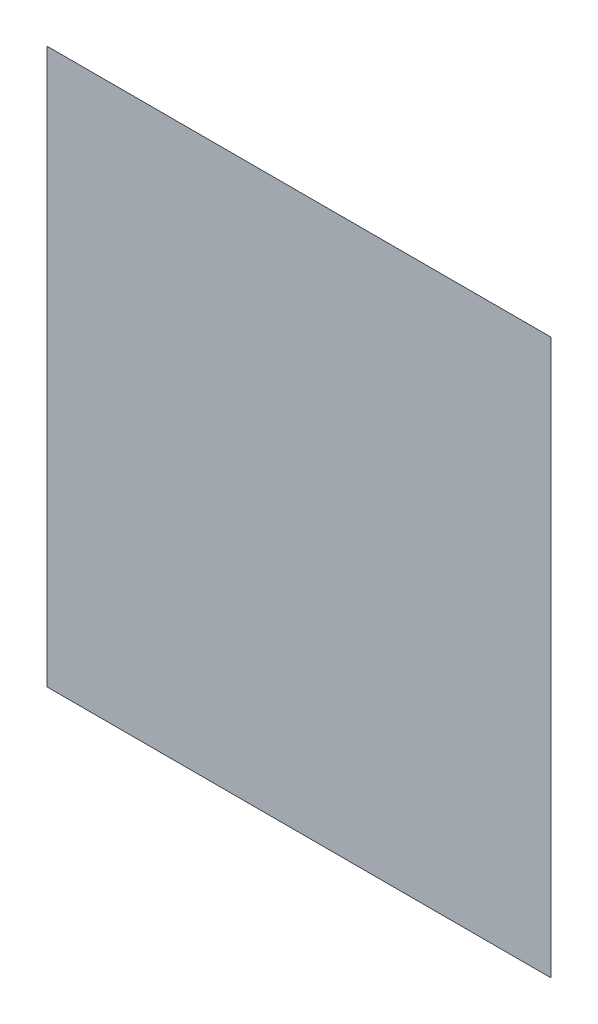
ISO-10303-21;
HEADER;
FILE_DESCRIPTION(('STEP AP214'),'2;1');
FILE_NAME('part.step','',(''),(''),'','','');
FILE_SCHEMA(('AUTOMOTIVE_DESIGN { 1 0 10303 214 1 1 1 1 }'));
ENDSEC;
DATA;
#1=APPLICATION_CONTEXT('core data for automotive mechanical design processes');
#2=APPLICATION_PROTOCOL_DEFINITION('international standard','automotive_design',2000,#1);
#3=PRODUCT_CONTEXT('',#1,'mechanical');
#4=PRODUCT('Part','Part','',(#3));
#5=PRODUCT_RELATED_PRODUCT_CATEGORY('part','',(#4));
#6=PRODUCT_DEFINITION_FORMATION('','',#4);
#7=PRODUCT_DEFINITION_CONTEXT('part definition',#1,'design');
#8=PRODUCT_DEFINITION('design','',#6,#7);
#9=PRODUCT_DEFINITION_SHAPE('','',#8);
#10=(LENGTH_UNIT() NAMED_UNIT(*) SI_UNIT(.MILLI.,.METRE.));
#11=(NAMED_UNIT(*) PLANE_ANGLE_UNIT() SI_UNIT($,.RADIAN.));
#12=(NAMED_UNIT(*) SI_UNIT($,.STERADIAN.) SOLID_ANGLE_UNIT());
#13=UNCERTAINTY_MEASURE_WITH_UNIT(LENGTH_MEASURE(1.E-05),#10,'distance_accuracy_value','');
#14=(GEOMETRIC_REPRESENTATION_CONTEXT(3) GLOBAL_UNCERTAINTY_ASSIGNED_CONTEXT((#13)) GLOBAL_UNIT_ASSIGNED_CONTEXT((#10,
#11,#12)) REPRESENTATION_CONTEXT('',''));
#15=CARTESIAN_POINT('',(0.,0.,0.));
#16=DIRECTION('',(0.,0.,1.));
#17=DIRECTION('',(1.,0.,0.));
#18=AXIS2_PLACEMENT_3D('',#15,#16,#17);
#19=CARTESIAN_POINT('',(-10.,11.,0.0001));
#20=DIRECTION('',(1.,0.,0.));
#21=DIRECTION('',(0.,1.,0.));
#22=AXIS2_PLACEMENT_3D('',#19,#20,#21);
#23=PLANE('',#22);
#24=DIRECTION('',(0.,-1.,0.));
#25=VECTOR('',#24,1.);
#26=CARTESIAN_POINT('',(-10.,11.,0.));
#27=LINE('',#26,#25);
#28=CARTESIAN_POINT('',(-10.,11.,0.));
#29=VERTEX_POINT('',#28);
#30=CARTESIAN_POINT('',(-10.,-11.,0.));
#31=VERTEX_POINT('',#30);
#32=EDGE_CURVE('E98',#29,#31,#27,.T.);
#33=ORIENTED_EDGE('',*,*,#32,.T.);
#34=DIRECTION('',(0.,0.,-1.));
#35=VECTOR('',#34,1.);
#36=CARTESIAN_POINT('',(-10.,-11.,0.0001));
#37=LINE('',#36,#35);
#38=CARTESIAN_POINT('',(-10.,-11.,0.0001));
#39=VERTEX_POINT('',#38);
#40=EDGE_CURVE('E11',#39,#31,#37,.T.);
#41=ORIENTED_EDGE('',*,*,#40,.F.);
#42=DIRECTION('',(0.,-1.,0.));
#43=VECTOR('',#42,1.);
#44=CARTESIAN_POINT('',(-10.,11.,0.0001));
#45=LINE('',#44,#43);
#46=CARTESIAN_POINT('',(-10.,11.,0.0001));
#47=VERTEX_POINT('',#46);
#48=EDGE_CURVE('E86',#47,#39,#45,.T.);
#49=ORIENTED_EDGE('',*,*,#48,.F.);
#50=DIRECTION('',(0.,0.,-1.));
#51=VECTOR('',#50,1.);
#52=CARTESIAN_POINT('',(-10.,11.,0.0001));
#53=LINE('',#52,#51);
#54=EDGE_CURVE('E94',#47,#29,#53,.T.);
#55=ORIENTED_EDGE('',*,*,#54,.T.);
#56=EDGE_LOOP('',(#33,#41,#49,#55));
#57=FACE_BOUND('',#56,.T.);
#58=ADVANCED_FACE('F35',(#57),#23,.F.);
#59=CARTESIAN_POINT('',(-10.,-11.,0.0001));
#60=DIRECTION('',(0.,1.,0.));
#61=DIRECTION('',(0.,0.,1.));
#62=AXIS2_PLACEMENT_3D('',#59,#60,#61);
#63=PLANE('',#62);
#64=DIRECTION('',(1.,0.,0.));
#65=VECTOR('',#64,1.);
#66=CARTESIAN_POINT('',(-10.,-11.,0.));
#67=LINE('',#66,#65);
#68=CARTESIAN_POINT('',(10.,-11.,0.));
#69=VERTEX_POINT('',#68);
#70=EDGE_CURVE('E90',#31,#69,#67,.T.);
#71=ORIENTED_EDGE('',*,*,#70,.T.);
#72=DIRECTION('',(0.,0.,-1.));
#73=VECTOR('',#72,1.);
#74=CARTESIAN_POINT('',(10.,-11.,0.0001));
#75=LINE('',#74,#73);
#76=CARTESIAN_POINT('',(10.,-11.,0.0001));
#77=VERTEX_POINT('',#76);
#78=EDGE_CURVE('E43',#77,#69,#75,.T.);
#79=ORIENTED_EDGE('',*,*,#78,.F.);
#80=DIRECTION('',(1.,0.,0.));
#81=VECTOR('',#80,1.);
#82=CARTESIAN_POINT('',(-10.,-11.,0.0001));
#83=LINE('',#82,#81);
#84=EDGE_CURVE('E81',#39,#77,#83,.T.);
#85=ORIENTED_EDGE('',*,*,#84,.F.);
#86=ORIENTED_EDGE('',*,*,#40,.T.);
#87=EDGE_LOOP('',(#71,#79,#85,#86));
#88=FACE_BOUND('',#87,.T.);
#89=ADVANCED_FACE('F89',(#88),#63,.F.);
#90=CARTESIAN_POINT('',(10.,-11.,0.0001));
#91=DIRECTION('',(-1.,0.,0.));
#92=DIRECTION('',(0.,-1.,0.));
#93=AXIS2_PLACEMENT_3D('',#90,#91,#92);
#94=PLANE('',#93);
#95=DIRECTION('',(0.,1.,0.));
#96=VECTOR('',#95,1.);
#97=CARTESIAN_POINT('',(10.,-11.,0.));
#98=LINE('',#97,#96);
#99=CARTESIAN_POINT('',(10.,11.,0.));
#100=VERTEX_POINT('',#99);
#101=EDGE_CURVE('E68',#69,#100,#98,.T.);
#102=ORIENTED_EDGE('',*,*,#101,.T.);
#103=DIRECTION('',(0.,0.,-1.));
#104=VECTOR('',#103,1.);
#105=CARTESIAN_POINT('',(10.,11.,0.0001));
#106=LINE('',#105,#104);
#107=CARTESIAN_POINT('',(10.,11.,0.0001));
#108=VERTEX_POINT('',#107);
#109=EDGE_CURVE('E91',#108,#100,#106,.T.);
#110=ORIENTED_EDGE('',*,*,#109,.F.);
#111=DIRECTION('',(0.,1.,0.));
#112=VECTOR('',#111,1.);
#113=CARTESIAN_POINT('',(10.,-11.,0.0001));
#114=LINE('',#113,#112);
#115=EDGE_CURVE('E84',#77,#108,#114,.T.);
#116=ORIENTED_EDGE('',*,*,#115,.F.);
#117=ORIENTED_EDGE('',*,*,#78,.T.);
#118=EDGE_LOOP('',(#102,#110,#116,#117));
#119=FACE_BOUND('',#118,.T.);
#120=ADVANCED_FACE('F92',(#119),#94,.F.);
#121=CARTESIAN_POINT('',(10.,11.,0.0001));
#122=DIRECTION('',(0.,-1.,0.));
#123=DIRECTION('',(1.,0.,0.));
#124=AXIS2_PLACEMENT_3D('',#121,#122,#123);
#125=PLANE('',#124);
#126=DIRECTION('',(-1.,0.,0.));
#127=VECTOR('',#126,1.);
#128=CARTESIAN_POINT('',(10.,11.,0.));
#129=LINE('',#128,#127);
#130=EDGE_CURVE('E74',#100,#29,#129,.T.);
#131=ORIENTED_EDGE('',*,*,#130,.T.);
#132=ORIENTED_EDGE('',*,*,#54,.F.);
#133=DIRECTION('',(-1.,0.,0.));
#134=VECTOR('',#133,1.);
#135=CARTESIAN_POINT('',(10.,11.,0.0001));
#136=LINE('',#135,#134);
#137=EDGE_CURVE('E51',#108,#47,#136,.T.);
#138=ORIENTED_EDGE('',*,*,#137,.F.);
#139=ORIENTED_EDGE('',*,*,#109,.T.);
#140=EDGE_LOOP('',(#131,#132,#138,#139));
#141=FACE_BOUND('',#140,.T.);
#142=ADVANCED_FACE('F105',(#141),#125,.F.);
#143=CARTESIAN_POINT('',(0.,0.,0.0001));
#144=DIRECTION('',(0.,0.,1.));
#145=DIRECTION('',(1.,0.,0.));
#146=AXIS2_PLACEMENT_3D('',#143,#144,#145);
#147=PLANE('',#146);
#148=ORIENTED_EDGE('',*,*,#48,.T.);
#149=ORIENTED_EDGE('',*,*,#84,.T.);
#150=ORIENTED_EDGE('',*,*,#115,.T.);
#151=ORIENTED_EDGE('',*,*,#137,.T.);
#152=EDGE_LOOP('',(#148,#149,#150,#151));
#153=FACE_BOUND('',#152,.T.);
#154=ADVANCED_FACE('F82',(#153),#147,.T.);
#155=CARTESIAN_POINT('',(0.,0.,0.));
#156=DIRECTION('',(0.,0.,1.));
#157=DIRECTION('',(1.,0.,0.));
#158=AXIS2_PLACEMENT_3D('',#155,#156,#157);
#159=PLANE('',#158);
#160=ORIENTED_EDGE('',*,*,#32,.F.);
#161=ORIENTED_EDGE('',*,*,#130,.F.);
#162=ORIENTED_EDGE('',*,*,#101,.F.);
#163=ORIENTED_EDGE('',*,*,#70,.F.);
#164=EDGE_LOOP('',(#160,#161,#162,#163));
#165=FACE_BOUND('',#164,.T.);
#166=ADVANCED_FACE('F108',(#165),#159,.F.);
#167=CLOSED_SHELL('',(#58,#89,#120,#142,#154,#166));
#168=MANIFOLD_SOLID_BREP('B2',#167);
#169=ADVANCED_BREP_SHAPE_REPRESENTATION('',(#18,#168),#14);
#170=SHAPE_DEFINITION_REPRESENTATION(#9,#169);
ENDSEC;
END-ISO-10303-21;
